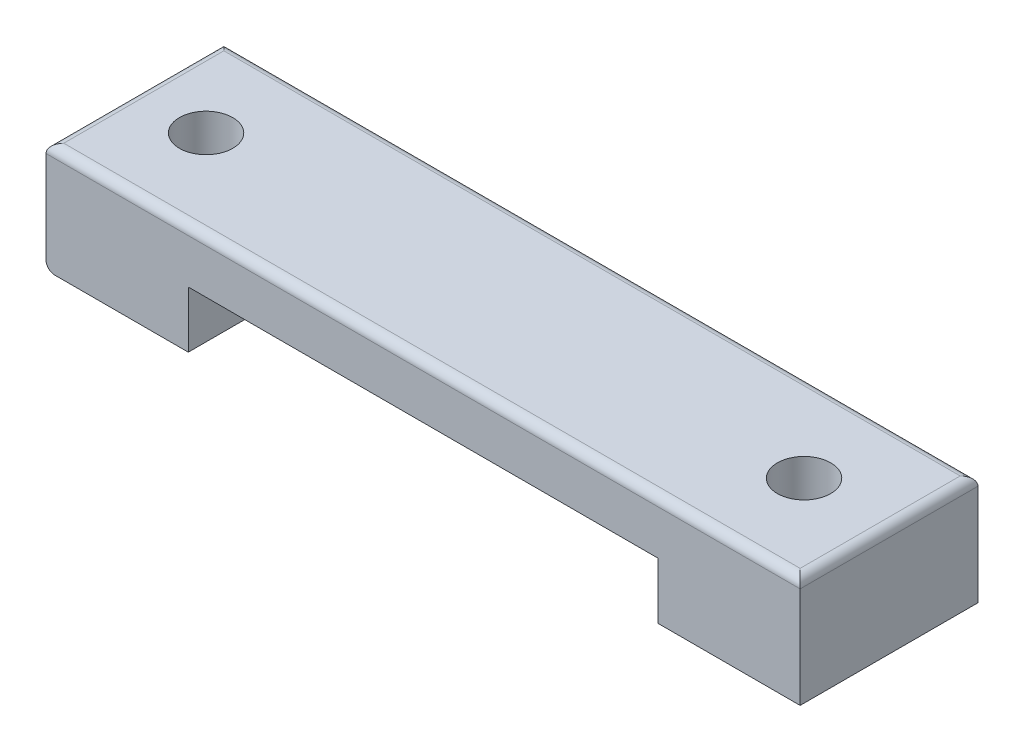
ISO-10303-21;
HEADER;
FILE_DESCRIPTION(('STEP AP214'),'2;1');
FILE_NAME('part.step','',(''),(''),'','','');
FILE_SCHEMA(('AUTOMOTIVE_DESIGN { 1 0 10303 214 1 1 1 1 }'));
ENDSEC;
DATA;
#1=APPLICATION_CONTEXT('core data for automotive mechanical design processes');
#2=APPLICATION_PROTOCOL_DEFINITION('international standard','automotive_design',2000,#1);
#3=PRODUCT_CONTEXT('',#1,'mechanical');
#4=PRODUCT('Part','Part','',(#3));
#5=PRODUCT_RELATED_PRODUCT_CATEGORY('part','',(#4));
#6=PRODUCT_DEFINITION_FORMATION('','',#4);
#7=PRODUCT_DEFINITION_CONTEXT('part definition',#1,'design');
#8=PRODUCT_DEFINITION('design','',#6,#7);
#9=PRODUCT_DEFINITION_SHAPE('','',#8);
#10=(LENGTH_UNIT() NAMED_UNIT(*) SI_UNIT(.MILLI.,.METRE.));
#11=(NAMED_UNIT(*) PLANE_ANGLE_UNIT() SI_UNIT($,.RADIAN.));
#12=(NAMED_UNIT(*) SI_UNIT($,.STERADIAN.) SOLID_ANGLE_UNIT());
#13=UNCERTAINTY_MEASURE_WITH_UNIT(LENGTH_MEASURE(1.E-05),#10,'distance_accuracy_value','');
#14=(GEOMETRIC_REPRESENTATION_CONTEXT(3) GLOBAL_UNCERTAINTY_ASSIGNED_CONTEXT((#13)) GLOBAL_UNIT_ASSIGNED_CONTEXT((#10,
#11,#12)) REPRESENTATION_CONTEXT('',''));
#15=CARTESIAN_POINT('',(0.,0.,0.));
#16=DIRECTION('',(0.,0.,1.));
#17=DIRECTION('',(1.,0.,0.));
#18=AXIS2_PLACEMENT_3D('',#15,#16,#17);
#19=CARTESIAN_POINT('',(-21.2,-1.5875,-40.));
#20=DIRECTION('',(0.,-1.,0.));
#21=DIRECTION('',(0.,0.,-1.));
#22=AXIS2_PLACEMENT_3D('',#19,#20,#21);
#23=PLANE('',#22);
#24=CARTESIAN_POINT('',(-17.2,-1.5875,-35.));
#25=DIRECTION('',(0.,-1.,0.));
#26=DIRECTION('',(0.,0.,-1.));
#27=AXIS2_PLACEMENT_3D('',#24,#25,#26);
#28=CIRCLE('',#27,1.5);
#29=CARTESIAN_POINT('',(-17.2,-1.5875,-36.5));
#30=VERTEX_POINT('',#29);
#31=EDGE_CURVE('E222',#30,#30,#28,.T.);
#32=ORIENTED_EDGE('',*,*,#31,.F.);
#33=EDGE_LOOP('',(#32));
#34=FACE_BOUND('',#33,.T.);
#35=DIRECTION('',(1.,0.,0.));
#36=VECTOR('',#35,1.);
#37=CARTESIAN_POINT('',(-21.2,-1.5875,-30.));
#38=LINE('',#37,#36);
#39=CARTESIAN_POINT('',(-20.7,-1.5875,-30.));
#40=VERTEX_POINT('',#39);
#41=CARTESIAN_POINT('',(-13.2,-1.5875,-30.));
#42=VERTEX_POINT('',#41);
#43=EDGE_CURVE('E156',#40,#42,#38,.T.);
#44=ORIENTED_EDGE('',*,*,#43,.F.);
#45=DIRECTION('',(0.,0.,1.));
#46=VECTOR('',#45,1.);
#47=CARTESIAN_POINT('',(-20.7,-1.5875,-40.));
#48=LINE('',#47,#46);
#49=CARTESIAN_POINT('',(-20.7,-1.5875,-40.));
#50=VERTEX_POINT('',#49);
#51=EDGE_CURVE('E123',#40,#50,#48,.F.);
#52=ORIENTED_EDGE('',*,*,#51,.T.);
#53=DIRECTION('',(1.,0.,0.));
#54=VECTOR('',#53,1.);
#55=CARTESIAN_POINT('',(-21.2,-1.5875,-40.));
#56=LINE('',#55,#54);
#57=CARTESIAN_POINT('',(-13.2,-1.5875,-40.));
#58=VERTEX_POINT('',#57);
#59=EDGE_CURVE('E117',#50,#58,#56,.T.);
#60=ORIENTED_EDGE('',*,*,#59,.T.);
#61=DIRECTION('',(0.,0.,1.));
#62=VECTOR('',#61,1.);
#63=CARTESIAN_POINT('',(-13.2,-1.5875,-40.));
#64=LINE('',#63,#62);
#65=EDGE_CURVE('E120',#58,#42,#64,.T.);
#66=ORIENTED_EDGE('',*,*,#65,.T.);
#67=EDGE_LOOP('',(#44,#52,#60,#66));
#68=FACE_BOUND('',#67,.T.);
#69=ADVANCED_FACE('F32',(#34,#68),#23,.T.);
#70=CARTESIAN_POINT('',(-21.2,4.5875,-40.));
#71=DIRECTION('',(-1.,0.,0.));
#72=DIRECTION('',(0.,0.,1.));
#73=AXIS2_PLACEMENT_3D('',#70,#71,#72);
#74=PLANE('',#73);
#75=DIRECTION('',(0.,-1.,0.));
#76=VECTOR('',#75,1.);
#77=CARTESIAN_POINT('',(-21.2,4.5875,-30.));
#78=LINE('',#77,#76);
#79=CARTESIAN_POINT('',(-21.2,4.0875,-30.));
#80=VERTEX_POINT('',#79);
#81=CARTESIAN_POINT('',(-21.2,-1.0875,-30.));
#82=VERTEX_POINT('',#81);
#83=EDGE_CURVE('E128',#80,#82,#78,.T.);
#84=ORIENTED_EDGE('',*,*,#83,.F.);
#85=DIRECTION('',(0.,0.,1.));
#86=VECTOR('',#85,1.);
#87=CARTESIAN_POINT('',(-21.2,4.0875,-40.));
#88=LINE('',#87,#86);
#89=CARTESIAN_POINT('',(-21.2,4.0875,-40.));
#90=VERTEX_POINT('',#89);
#91=EDGE_CURVE('E56',#80,#90,#88,.F.);
#92=ORIENTED_EDGE('',*,*,#91,.T.);
#93=DIRECTION('',(0.,-1.,0.));
#94=VECTOR('',#93,1.);
#95=CARTESIAN_POINT('',(-21.2,4.5875,-40.));
#96=LINE('',#95,#94);
#97=CARTESIAN_POINT('',(-21.2,-1.0875,-40.));
#98=VERTEX_POINT('',#97);
#99=EDGE_CURVE('E136',#90,#98,#96,.T.);
#100=ORIENTED_EDGE('',*,*,#99,.T.);
#101=DIRECTION('',(0.,0.,1.));
#102=VECTOR('',#101,1.);
#103=CARTESIAN_POINT('',(-21.2,-1.0875,-40.));
#104=LINE('',#103,#102);
#105=EDGE_CURVE('E175',#98,#82,#104,.T.);
#106=ORIENTED_EDGE('',*,*,#105,.T.);
#107=EDGE_LOOP('',(#84,#92,#100,#106));
#108=FACE_BOUND('',#107,.T.);
#109=ADVANCED_FACE('F233',(#108),#74,.T.);
#110=CARTESIAN_POINT('',(21.2,4.5875,-40.));
#111=DIRECTION('',(0.,1.,0.));
#112=DIRECTION('',(-1.,0.,0.));
#113=AXIS2_PLACEMENT_3D('',#110,#111,#112);
#114=PLANE('',#113);
#115=DIRECTION('',(0.,0.,1.));
#116=VECTOR('',#115,1.);
#117=CARTESIAN_POINT('',(-20.7,4.5875,-40.));
#118=LINE('',#117,#116);
#119=CARTESIAN_POINT('',(-20.7,4.5875,-39.5));
#120=VERTEX_POINT('',#119);
#121=CARTESIAN_POINT('',(-20.7,4.5875,-30.5));
#122=VERTEX_POINT('',#121);
#123=EDGE_CURVE('E195',#120,#122,#118,.T.);
#124=ORIENTED_EDGE('',*,*,#123,.T.);
#125=DIRECTION('',(-1.,0.,0.));
#126=VECTOR('',#125,1.);
#127=CARTESIAN_POINT('',(21.2,4.5875,-30.5));
#128=LINE('',#127,#126);
#129=CARTESIAN_POINT('',(20.7,4.5875,-30.5));
#130=VERTEX_POINT('',#129);
#131=EDGE_CURVE('E197',#122,#130,#128,.F.);
#132=ORIENTED_EDGE('',*,*,#131,.T.);
#133=DIRECTION('',(0.,0.,1.));
#134=VECTOR('',#133,1.);
#135=CARTESIAN_POINT('',(20.7,4.5875,-40.));
#136=LINE('',#135,#134);
#137=CARTESIAN_POINT('',(20.7,4.5875,-39.5));
#138=VERTEX_POINT('',#137);
#139=EDGE_CURVE('E191',#130,#138,#136,.F.);
#140=ORIENTED_EDGE('',*,*,#139,.T.);
#141=DIRECTION('',(-1.,0.,0.));
#142=VECTOR('',#141,1.);
#143=CARTESIAN_POINT('',(21.2,4.5875,-39.5));
#144=LINE('',#143,#142);
#145=EDGE_CURVE('E193',#138,#120,#144,.T.);
#146=ORIENTED_EDGE('',*,*,#145,.T.);
#147=EDGE_LOOP('',(#124,#132,#140,#146));
#148=FACE_BOUND('',#147,.T.);
#149=CARTESIAN_POINT('',(-17.2,4.5875,-35.));
#150=DIRECTION('',(0.,1.,0.));
#151=DIRECTION('',(-1.,0.,0.));
#152=AXIS2_PLACEMENT_3D('',#149,#150,#151);
#153=CIRCLE('',#152,1.5);
#154=CARTESIAN_POINT('',(-18.7,4.5875,-35.));
#155=VERTEX_POINT('',#154);
#156=EDGE_CURVE('E158',#155,#155,#153,.F.);
#157=ORIENTED_EDGE('',*,*,#156,.T.);
#158=EDGE_LOOP('',(#157));
#159=FACE_BOUND('',#158,.T.);
#160=CARTESIAN_POINT('',(16.4207109620847,4.5875,-35.));
#161=DIRECTION('',(0.,1.,0.));
#162=DIRECTION('',(-1.,0.,0.));
#163=AXIS2_PLACEMENT_3D('',#160,#161,#162);
#164=CIRCLE('',#163,1.50000000000001);
#165=CARTESIAN_POINT('',(14.9207109620847,4.5875,-35.));
#166=VERTEX_POINT('',#165);
#167=EDGE_CURVE('E217',#166,#166,#164,.F.);
#168=ORIENTED_EDGE('',*,*,#167,.T.);
#169=EDGE_LOOP('',(#168));
#170=FACE_BOUND('',#169,.T.);
#171=ADVANCED_FACE('F238',(#148,#159,#170),#114,.T.);
#172=CARTESIAN_POINT('',(21.2,-1.5875,-40.));
#173=DIRECTION('',(1.,0.,0.));
#174=DIRECTION('',(0.,0.,-1.));
#175=AXIS2_PLACEMENT_3D('',#172,#173,#174);
#176=PLANE('',#175);
#177=DIRECTION('',(0.,1.,0.));
#178=VECTOR('',#177,1.);
#179=CARTESIAN_POINT('',(21.2,-1.5875,-40.));
#180=LINE('',#179,#178);
#181=CARTESIAN_POINT('',(21.2,-1.5875,-40.));
#182=VERTEX_POINT('',#181);
#183=CARTESIAN_POINT('',(21.2,4.0875,-40.));
#184=VERTEX_POINT('',#183);
#185=EDGE_CURVE('E153',#182,#184,#180,.T.);
#186=ORIENTED_EDGE('',*,*,#185,.T.);
#187=DIRECTION('',(0.,0.,1.));
#188=VECTOR('',#187,1.);
#189=CARTESIAN_POINT('',(21.2,4.0875,-40.));
#190=LINE('',#189,#188);
#191=CARTESIAN_POINT('',(21.2,4.0875,-30.));
#192=VERTEX_POINT('',#191);
#193=EDGE_CURVE('E11',#184,#192,#190,.T.);
#194=ORIENTED_EDGE('',*,*,#193,.T.);
#195=DIRECTION('',(0.,1.,0.));
#196=VECTOR('',#195,1.);
#197=CARTESIAN_POINT('',(21.2,-1.5875,-30.));
#198=LINE('',#197,#196);
#199=CARTESIAN_POINT('',(21.2,-1.5875,-30.));
#200=VERTEX_POINT('',#199);
#201=EDGE_CURVE('E169',#200,#192,#198,.T.);
#202=ORIENTED_EDGE('',*,*,#201,.F.);
#203=DIRECTION('',(0.,0.,1.));
#204=VECTOR('',#203,1.);
#205=CARTESIAN_POINT('',(21.2,-1.5875,-40.));
#206=LINE('',#205,#204);
#207=EDGE_CURVE('E173',#182,#200,#206,.T.);
#208=ORIENTED_EDGE('',*,*,#207,.F.);
#209=EDGE_LOOP('',(#186,#194,#202,#208));
#210=FACE_BOUND('',#209,.T.);
#211=ADVANCED_FACE('F270',(#210),#176,.T.);
#212=CARTESIAN_POINT('',(13.2,-1.5875,-40.));
#213=DIRECTION('',(0.,-1.,0.));
#214=DIRECTION('',(0.,0.,-1.));
#215=AXIS2_PLACEMENT_3D('',#212,#213,#214);
#216=PLANE('',#215);
#217=CARTESIAN_POINT('',(16.4207109620847,-1.5875,-35.));
#218=DIRECTION('',(0.,-1.,0.));
#219=DIRECTION('',(0.,0.,-1.));
#220=AXIS2_PLACEMENT_3D('',#217,#218,#219);
#221=CIRCLE('',#220,1.50000000000001);
#222=CARTESIAN_POINT('',(16.4207109620847,-1.5875,-36.5));
#223=VERTEX_POINT('',#222);
#224=EDGE_CURVE('E211',#223,#223,#221,.T.);
#225=ORIENTED_EDGE('',*,*,#224,.F.);
#226=EDGE_LOOP('',(#225));
#227=FACE_BOUND('',#226,.T.);
#228=DIRECTION('',(1.,0.,0.));
#229=VECTOR('',#228,1.);
#230=CARTESIAN_POINT('',(13.2,-1.5875,-30.));
#231=LINE('',#230,#229);
#232=CARTESIAN_POINT('',(13.2,-1.5875,-30.));
#233=VERTEX_POINT('',#232);
#234=EDGE_CURVE('E166',#233,#200,#231,.T.);
#235=ORIENTED_EDGE('',*,*,#234,.F.);
#236=DIRECTION('',(0.,0.,1.));
#237=VECTOR('',#236,1.);
#238=CARTESIAN_POINT('',(13.2,-1.5875,-40.));
#239=LINE('',#238,#237);
#240=CARTESIAN_POINT('',(13.2,-1.5875,-40.));
#241=VERTEX_POINT('',#240);
#242=EDGE_CURVE('E176',#241,#233,#239,.T.);
#243=ORIENTED_EDGE('',*,*,#242,.F.);
#244=DIRECTION('',(1.,0.,0.));
#245=VECTOR('',#244,1.);
#246=CARTESIAN_POINT('',(13.2,-1.5875,-40.));
#247=LINE('',#246,#245);
#248=EDGE_CURVE('E150',#241,#182,#247,.T.);
#249=ORIENTED_EDGE('',*,*,#248,.T.);
#250=ORIENTED_EDGE('',*,*,#207,.T.);
#251=EDGE_LOOP('',(#235,#243,#249,#250));
#252=FACE_BOUND('',#251,.T.);
#253=ADVANCED_FACE('F276',(#227,#252),#216,.T.);
#254=CARTESIAN_POINT('',(13.2,-1.5875,-40.));
#255=DIRECTION('',(-1.,0.,0.));
#256=DIRECTION('',(0.,-1.,0.));
#257=AXIS2_PLACEMENT_3D('',#254,#255,#256);
#258=PLANE('',#257);
#259=DIRECTION('',(0.,-1.,0.));
#260=VECTOR('',#259,1.);
#261=CARTESIAN_POINT('',(13.2,-1.5875,-30.));
#262=LINE('',#261,#260);
#263=CARTESIAN_POINT('',(13.2,1.58750000000001,-30.));
#264=VERTEX_POINT('',#263);
#265=EDGE_CURVE('E163',#264,#233,#262,.T.);
#266=ORIENTED_EDGE('',*,*,#265,.F.);
#267=DIRECTION('',(0.,0.,1.));
#268=VECTOR('',#267,1.);
#269=CARTESIAN_POINT('',(13.2,1.58750000000001,-40.));
#270=LINE('',#269,#268);
#271=CARTESIAN_POINT('',(13.2,1.58750000000001,-40.));
#272=VERTEX_POINT('',#271);
#273=EDGE_CURVE('E178',#272,#264,#270,.T.);
#274=ORIENTED_EDGE('',*,*,#273,.F.);
#275=DIRECTION('',(0.,-1.,0.));
#276=VECTOR('',#275,1.);
#277=CARTESIAN_POINT('',(13.2,-1.5875,-40.));
#278=LINE('',#277,#276);
#279=EDGE_CURVE('E144',#272,#241,#278,.T.);
#280=ORIENTED_EDGE('',*,*,#279,.T.);
#281=ORIENTED_EDGE('',*,*,#242,.T.);
#282=EDGE_LOOP('',(#266,#274,#280,#281));
#283=FACE_BOUND('',#282,.T.);
#284=ADVANCED_FACE('F279',(#283),#258,.T.);
#285=CARTESIAN_POINT('',(13.2,1.58750000000001,-40.));
#286=DIRECTION('',(0.,-1.,0.));
#287=DIRECTION('',(1.,0.,0.));
#288=AXIS2_PLACEMENT_3D('',#285,#286,#287);
#289=PLANE('',#288);
#290=DIRECTION('',(1.,0.,0.));
#291=VECTOR('',#290,1.);
#292=CARTESIAN_POINT('',(13.2,1.58750000000001,-30.));
#293=LINE('',#292,#291);
#294=CARTESIAN_POINT('',(-13.2,1.58749999999999,-30.));
#295=VERTEX_POINT('',#294);
#296=EDGE_CURVE('E160',#295,#264,#293,.T.);
#297=ORIENTED_EDGE('',*,*,#296,.F.);
#298=DIRECTION('',(0.,0.,1.));
#299=VECTOR('',#298,1.);
#300=CARTESIAN_POINT('',(-13.2,1.58749999999999,-40.));
#301=LINE('',#300,#299);
#302=CARTESIAN_POINT('',(-13.2,1.58749999999999,-40.));
#303=VERTEX_POINT('',#302);
#304=EDGE_CURVE('E135',#303,#295,#301,.T.);
#305=ORIENTED_EDGE('',*,*,#304,.F.);
#306=DIRECTION('',(1.,0.,0.));
#307=VECTOR('',#306,1.);
#308=CARTESIAN_POINT('',(13.2,1.58750000000001,-40.));
#309=LINE('',#308,#307);
#310=EDGE_CURVE('E142',#303,#272,#309,.T.);
#311=ORIENTED_EDGE('',*,*,#310,.T.);
#312=ORIENTED_EDGE('',*,*,#273,.T.);
#313=EDGE_LOOP('',(#297,#305,#311,#312));
#314=FACE_BOUND('',#313,.T.);
#315=ADVANCED_FACE('F282',(#314),#289,.T.);
#316=CARTESIAN_POINT('',(-13.2,1.58749999999999,-40.));
#317=DIRECTION('',(1.,0.,0.));
#318=DIRECTION('',(0.,1.,0.));
#319=AXIS2_PLACEMENT_3D('',#316,#317,#318);
#320=PLANE('',#319);
#321=DIRECTION('',(0.,1.,0.));
#322=VECTOR('',#321,1.);
#323=CARTESIAN_POINT('',(-13.2,1.58749999999999,-30.));
#324=LINE('',#323,#322);
#325=EDGE_CURVE('E134',#42,#295,#324,.T.);
#326=ORIENTED_EDGE('',*,*,#325,.F.);
#327=ORIENTED_EDGE('',*,*,#65,.F.);
#328=DIRECTION('',(0.,1.,0.));
#329=VECTOR('',#328,1.);
#330=CARTESIAN_POINT('',(-13.2,1.58749999999999,-40.));
#331=LINE('',#330,#329);
#332=EDGE_CURVE('E127',#58,#303,#331,.T.);
#333=ORIENTED_EDGE('',*,*,#332,.T.);
#334=ORIENTED_EDGE('',*,*,#304,.T.);
#335=EDGE_LOOP('',(#326,#327,#333,#334));
#336=FACE_BOUND('',#335,.T.);
#337=ADVANCED_FACE('F132',(#336),#320,.T.);
#338=CARTESIAN_POINT('',(0.,0.,-40.));
#339=DIRECTION('',(0.,0.,-1.));
#340=DIRECTION('',(-1.,0.,0.));
#341=AXIS2_PLACEMENT_3D('',#338,#339,#340);
#342=PLANE('',#341);
#343=ORIENTED_EDGE('',*,*,#99,.F.);
#344=DIRECTION('',(-1.,0.,0.));
#345=VECTOR('',#344,1.);
#346=CARTESIAN_POINT('',(0.,4.0875,-40.));
#347=LINE('',#346,#345);
#348=EDGE_CURVE('E41',#90,#184,#347,.F.);
#349=ORIENTED_EDGE('',*,*,#348,.T.);
#350=ORIENTED_EDGE('',*,*,#185,.F.);
#351=ORIENTED_EDGE('',*,*,#248,.F.);
#352=ORIENTED_EDGE('',*,*,#279,.F.);
#353=ORIENTED_EDGE('',*,*,#310,.F.);
#354=ORIENTED_EDGE('',*,*,#332,.F.);
#355=ORIENTED_EDGE('',*,*,#59,.F.);
#356=CARTESIAN_POINT('',(-20.7,-1.0875,-40.));
#357=DIRECTION('',(0.,0.,-1.));
#358=DIRECTION('',(-1.,0.,0.));
#359=AXIS2_PLACEMENT_3D('',#356,#357,#358);
#360=CIRCLE('',#359,0.5);
#361=EDGE_CURVE('E186',#50,#98,#360,.T.);
#362=ORIENTED_EDGE('',*,*,#361,.T.);
#363=EDGE_LOOP('',(#343,#349,#350,#351,#352,#353,#354,#355,#362));
#364=FACE_BOUND('',#363,.T.);
#365=ADVANCED_FACE('F139',(#364),#342,.T.);
#366=CARTESIAN_POINT('',(0.,0.,-30.));
#367=DIRECTION('',(0.,0.,-1.));
#368=DIRECTION('',(-1.,0.,0.));
#369=AXIS2_PLACEMENT_3D('',#366,#367,#368);
#370=PLANE('',#369);
#371=ORIENTED_EDGE('',*,*,#201,.T.);
#372=DIRECTION('',(-1.,0.,0.));
#373=VECTOR('',#372,1.);
#374=CARTESIAN_POINT('',(-21.2,4.0875,-30.));
#375=LINE('',#374,#373);
#376=EDGE_CURVE('E188',#192,#80,#375,.T.);
#377=ORIENTED_EDGE('',*,*,#376,.T.);
#378=ORIENTED_EDGE('',*,*,#83,.T.);
#379=CARTESIAN_POINT('',(-20.7,-1.0875,-30.));
#380=DIRECTION('',(0.,0.,-1.));
#381=DIRECTION('',(-1.,0.,0.));
#382=AXIS2_PLACEMENT_3D('',#379,#380,#381);
#383=CIRCLE('',#382,0.5);
#384=EDGE_CURVE('E183',#82,#40,#383,.F.);
#385=ORIENTED_EDGE('',*,*,#384,.T.);
#386=ORIENTED_EDGE('',*,*,#43,.T.);
#387=ORIENTED_EDGE('',*,*,#325,.T.);
#388=ORIENTED_EDGE('',*,*,#296,.T.);
#389=ORIENTED_EDGE('',*,*,#265,.T.);
#390=ORIENTED_EDGE('',*,*,#234,.T.);
#391=EDGE_LOOP('',(#371,#377,#378,#385,#386,#387,#388,#389,#390));
#392=FACE_BOUND('',#391,.T.);
#393=ADVANCED_FACE('F272',(#392),#370,.F.);
#394=CARTESIAN_POINT('',(16.4207109620847,8.83014068711931,-35.));
#395=DIRECTION('',(0.,-1.,0.));
#396=DIRECTION('',(0.,0.,-1.));
#397=AXIS2_PLACEMENT_3D('',#394,#395,#396);
#398=CYLINDRICAL_SURFACE('',#397,1.50000000000001);
#399=ORIENTED_EDGE('',*,*,#224,.T.);
#400=EDGE_LOOP('',(#399));
#401=FACE_BOUND('',#400,.T.);
#402=ORIENTED_EDGE('',*,*,#167,.F.);
#403=EDGE_LOOP('',(#402));
#404=FACE_BOUND('',#403,.T.);
#405=ADVANCED_FACE('F301',(#401,#404),#398,.F.);
#406=CARTESIAN_POINT('',(-17.2,8.83014068711931,-35.));
#407=DIRECTION('',(0.,-1.,0.));
#408=DIRECTION('',(0.,0.,-1.));
#409=AXIS2_PLACEMENT_3D('',#406,#407,#408);
#410=CYLINDRICAL_SURFACE('',#409,1.5);
#411=ORIENTED_EDGE('',*,*,#31,.T.);
#412=EDGE_LOOP('',(#411));
#413=FACE_BOUND('',#412,.T.);
#414=ORIENTED_EDGE('',*,*,#156,.F.);
#415=EDGE_LOOP('',(#414));
#416=FACE_BOUND('',#415,.T.);
#417=ADVANCED_FACE('F229',(#413,#416),#410,.F.);
#418=CARTESIAN_POINT('',(-20.7,-1.0875,-40.));
#419=DIRECTION('',(0.,0.,1.));
#420=DIRECTION('',(1.,0.,0.));
#421=AXIS2_PLACEMENT_3D('',#418,#419,#420);
#422=CYLINDRICAL_SURFACE('',#421,0.5);
#423=ORIENTED_EDGE('',*,*,#361,.F.);
#424=ORIENTED_EDGE('',*,*,#51,.F.);
#425=ORIENTED_EDGE('',*,*,#384,.F.);
#426=ORIENTED_EDGE('',*,*,#105,.F.);
#427=EDGE_LOOP('',(#423,#424,#425,#426));
#428=FACE_BOUND('',#427,.T.);
#429=ADVANCED_FACE('F243',(#428),#422,.T.);
#430=CARTESIAN_POINT('',(21.2,4.0875,-39.5));
#431=DIRECTION('',(-1.,0.,0.));
#432=DIRECTION('',(0.,-1.,0.));
#433=AXIS2_PLACEMENT_3D('',#430,#431,#432);
#434=CYLINDRICAL_SURFACE('',#433,0.5);
#435=CARTESIAN_POINT('',(-20.7,4.0875,-39.5));
#436=DIRECTION('',(-0.707106781186547,0.,0.707106781186547));
#437=DIRECTION('',(-0.707106781186547,0.,-0.707106781186547));
#438=AXIS2_PLACEMENT_3D('',#435,#436,#437);
#439=ELLIPSE('',#438,0.707106781186547,0.5);
#440=EDGE_CURVE('E205',#120,#90,#439,.T.);
#441=ORIENTED_EDGE('',*,*,#440,.F.);
#442=ORIENTED_EDGE('',*,*,#145,.F.);
#443=CARTESIAN_POINT('',(20.7,4.0875,-39.5));
#444=DIRECTION('',(0.707106781186547,0.,0.707106781186547));
#445=DIRECTION('',(-0.707106781186547,0.,0.707106781186547));
#446=AXIS2_PLACEMENT_3D('',#443,#444,#445);
#447=ELLIPSE('',#446,0.707106781186547,0.5);
#448=EDGE_CURVE('E36',#184,#138,#447,.T.);
#449=ORIENTED_EDGE('',*,*,#448,.F.);
#450=ORIENTED_EDGE('',*,*,#348,.F.);
#451=EDGE_LOOP('',(#441,#442,#449,#450));
#452=FACE_BOUND('',#451,.T.);
#453=ADVANCED_FACE('F34',(#452),#434,.T.);
#454=CARTESIAN_POINT('',(20.7,4.0875,-40.));
#455=DIRECTION('',(0.,0.,1.));
#456=DIRECTION('',(1.,0.,0.));
#457=AXIS2_PLACEMENT_3D('',#454,#455,#456);
#458=CYLINDRICAL_SURFACE('',#457,0.5);
#459=ORIENTED_EDGE('',*,*,#448,.T.);
#460=ORIENTED_EDGE('',*,*,#139,.F.);
#461=CARTESIAN_POINT('',(20.7,4.0875,-30.5));
#462=DIRECTION('',(-0.707106781186547,0.,0.707106781186547));
#463=DIRECTION('',(0.707106781186547,0.,0.707106781186547));
#464=AXIS2_PLACEMENT_3D('',#461,#462,#463);
#465=ELLIPSE('',#464,0.707106781186547,0.5);
#466=EDGE_CURVE('E204',#192,#130,#465,.T.);
#467=ORIENTED_EDGE('',*,*,#466,.F.);
#468=ORIENTED_EDGE('',*,*,#193,.F.);
#469=EDGE_LOOP('',(#459,#460,#467,#468));
#470=FACE_BOUND('',#469,.T.);
#471=ADVANCED_FACE('F253',(#470),#458,.T.);
#472=CARTESIAN_POINT('',(-20.7,4.0875,-40.));
#473=DIRECTION('',(0.,0.,1.));
#474=DIRECTION('',(1.,0.,0.));
#475=AXIS2_PLACEMENT_3D('',#472,#473,#474);
#476=CYLINDRICAL_SURFACE('',#475,0.5);
#477=ORIENTED_EDGE('',*,*,#440,.T.);
#478=ORIENTED_EDGE('',*,*,#91,.F.);
#479=CARTESIAN_POINT('',(-20.7,4.0875,-30.5));
#480=DIRECTION('',(0.707106781186547,0.,0.707106781186547));
#481=DIRECTION('',(-0.707106781186547,0.,0.707106781186547));
#482=AXIS2_PLACEMENT_3D('',#479,#480,#481);
#483=ELLIPSE('',#482,0.707106781186547,0.5);
#484=EDGE_CURVE('E202',#122,#80,#483,.T.);
#485=ORIENTED_EDGE('',*,*,#484,.F.);
#486=ORIENTED_EDGE('',*,*,#123,.F.);
#487=EDGE_LOOP('',(#477,#478,#485,#486));
#488=FACE_BOUND('',#487,.T.);
#489=ADVANCED_FACE('F250',(#488),#476,.T.);
#490=CARTESIAN_POINT('',(0.,4.0875,-30.5));
#491=DIRECTION('',(1.,0.,0.));
#492=DIRECTION('',(0.,1.,0.));
#493=AXIS2_PLACEMENT_3D('',#490,#491,#492);
#494=CYLINDRICAL_SURFACE('',#493,0.5);
#495=ORIENTED_EDGE('',*,*,#466,.T.);
#496=ORIENTED_EDGE('',*,*,#131,.F.);
#497=ORIENTED_EDGE('',*,*,#484,.T.);
#498=ORIENTED_EDGE('',*,*,#376,.F.);
#499=EDGE_LOOP('',(#495,#496,#497,#498));
#500=FACE_BOUND('',#499,.T.);
#501=ADVANCED_FACE('F247',(#500),#494,.T.);
#502=CLOSED_SHELL('',(#69,#109,#171,#211,#253,#284,#315,#337,#365,#393,#405,#417,#429,#453,#471,
#489,#501));
#503=MANIFOLD_SOLID_BREP('B2',#502);
#504=ADVANCED_BREP_SHAPE_REPRESENTATION('',(#18,#503),#14);
#505=SHAPE_DEFINITION_REPRESENTATION(#9,#504);
ENDSEC;
END-ISO-10303-21;
